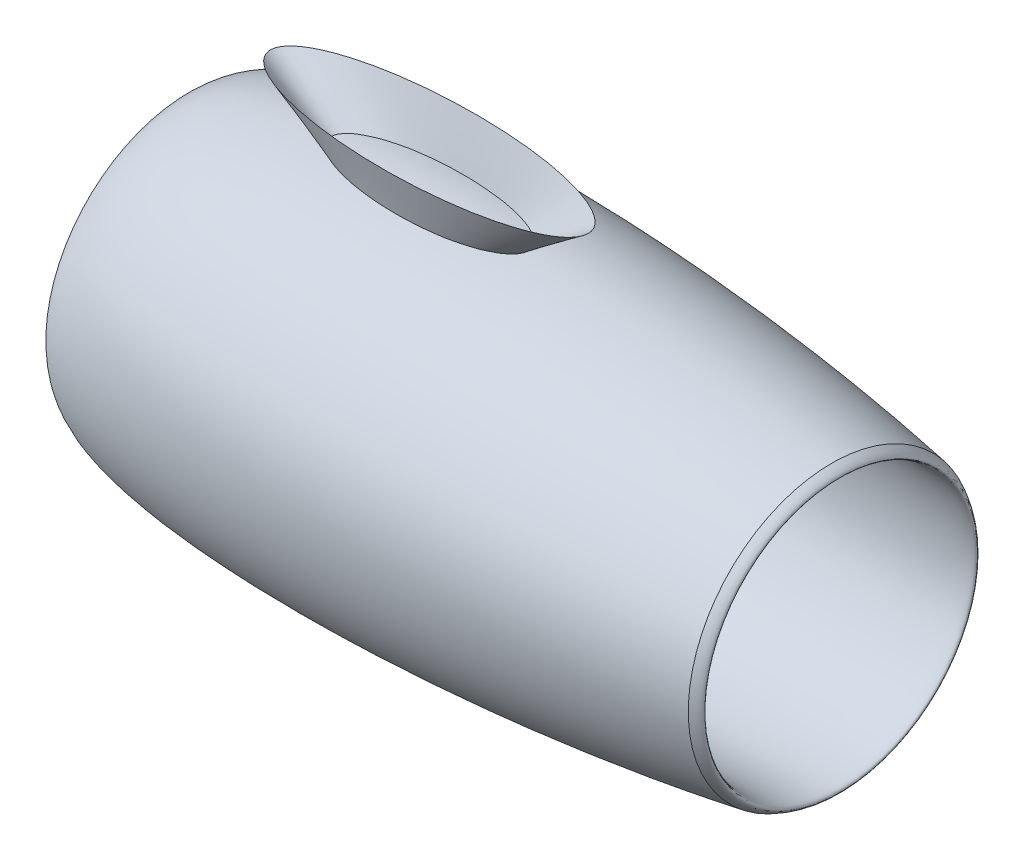
ISO-10303-21;
HEADER;
FILE_DESCRIPTION(('STEP AP214'),'2;1');
FILE_NAME('part.step','',(''),(''),'','','');
FILE_SCHEMA(('AUTOMOTIVE_DESIGN { 1 0 10303 214 1 1 1 1 }'));
ENDSEC;
DATA;
#1=APPLICATION_CONTEXT('core data for automotive mechanical design processes');
#2=APPLICATION_PROTOCOL_DEFINITION('international standard','automotive_design',2000,#1);
#3=PRODUCT_CONTEXT('',#1,'mechanical');
#4=PRODUCT('Part','Part','',(#3));
#5=PRODUCT_RELATED_PRODUCT_CATEGORY('part','',(#4));
#6=PRODUCT_DEFINITION_FORMATION('','',#4);
#7=PRODUCT_DEFINITION_CONTEXT('part definition',#1,'design');
#8=PRODUCT_DEFINITION('design','',#6,#7);
#9=PRODUCT_DEFINITION_SHAPE('','',#8);
#10=(LENGTH_UNIT() NAMED_UNIT(*) SI_UNIT(.MILLI.,.METRE.));
#11=(NAMED_UNIT(*) PLANE_ANGLE_UNIT() SI_UNIT($,.RADIAN.));
#12=(NAMED_UNIT(*) SI_UNIT($,.STERADIAN.) SOLID_ANGLE_UNIT());
#13=UNCERTAINTY_MEASURE_WITH_UNIT(LENGTH_MEASURE(1.E-05),#10,'distance_accuracy_value','');
#14=(GEOMETRIC_REPRESENTATION_CONTEXT(3) GLOBAL_UNCERTAINTY_ASSIGNED_CONTEXT((#13)) GLOBAL_UNIT_ASSIGNED_CONTEXT((#10,
#11,#12)) REPRESENTATION_CONTEXT('',''));
#15=CARTESIAN_POINT('',(0.,0.,0.));
#16=DIRECTION('',(0.,0.,1.));
#17=DIRECTION('',(1.,0.,0.));
#18=AXIS2_PLACEMENT_3D('',#15,#16,#17);
#19=CARTESIAN_POINT('',(-975.222832465383,900.,20.7662660225526));
#20=CARTESIAN_POINT('',(-711.589974985776,700.,-14.2371569140713));
#21=CARTESIAN_POINT('',(-1115.85052868828,900.,-359.814852146137));
#22=CARTESIAN_POINT('',(-630.438180575572,700.,-281.384033207584));
#23=CARTESIAN_POINT('',(172.78378370742,900.,-401.347384191243));
#24=CARTESIAN_POINT('',(130.930416860912,700.,-252.909719379441));
#25=CARTESIAN_POINT('',(313.411479930316,900.,-20.7662660225526));
#26=CARTESIAN_POINT('',(49.7786224507086,700.,14.2371569140713));
#27=CARTESIAN_POINT('',(454.039176153211,900.,359.814852146137));
#28=CARTESIAN_POINT('',(-31.3731719594948,700.,281.384033207584));
#29=CARTESIAN_POINT('',(-834.595136242487,900.,401.347384191243));
#30=CARTESIAN_POINT('',(-792.741769395979,700.,252.909719379441));
#31=CARTESIAN_POINT('',(-975.222832465383,900.,20.7662660225526));
#32=CARTESIAN_POINT('',(-711.589974985776,700.,-14.2371569140713));
#33=(BOUNDED_SURFACE() B_SPLINE_SURFACE(3,1,((#19,#20),(#21,#22),(#23,#24),(#25,#26),(#27,#28),
(#29,#30),(#31,#32)),.UNSPECIFIED.,.T.,.F.,.F.) B_SPLINE_SURFACE_WITH_KNOTS((4,3,4),(2,2),(0.,
0.5,1.),(0.,1.),.UNSPECIFIED.) GEOMETRIC_REPRESENTATION_ITEM() RATIONAL_B_SPLINE_SURFACE(((1.,
1.),(0.333333333333333,0.333333333333333),(0.333333333333333,0.333333333333333),(1.,1.),
(0.333333333333333,0.333333333333333),(0.333333333333333,0.333333333333333),(1.,1.))) REPRESENTATION_ITEM('') SURFACE());
#34=CARTESIAN_POINT('',(-975.222832465383,900.,20.7662660225526));
#35=CARTESIAN_POINT('',(-1115.85052868828,900.,-359.814852146137));
#36=CARTESIAN_POINT('',(172.78378370742,900.,-401.347384191243));
#37=CARTESIAN_POINT('',(313.411479930316,900.,-20.7662660225526));
#38=CARTESIAN_POINT('',(454.039176153211,900.,359.814852146137));
#39=CARTESIAN_POINT('',(-834.595136242487,900.,401.347384191243));
#40=CARTESIAN_POINT('',(-975.222832465383,900.,20.7662660225526));
#41=(BOUNDED_CURVE() B_SPLINE_CURVE(3,(#34,#35,#36,#37,#38,#39,#40),.UNSPECIFIED.,.T.,
.F.) B_SPLINE_CURVE_WITH_KNOTS((4,3,4),(0.,0.5,1.),
.UNSPECIFIED.) CURVE() GEOMETRIC_REPRESENTATION_ITEM() RATIONAL_B_SPLINE_CURVE((1.,
0.333333333333333,0.333333333333333,1.,0.333333333333333,0.333333333333333,1.)) REPRESENTATION_ITEM(''));
#42=CARTESIAN_POINT('',(-975.222832465383,900.,20.7662660225526));
#43=VERTEX_POINT('',#42);
#44=EDGE_CURVE('E11',#43,#43,#41,.T.);
#45=CARTESIAN_POINT('',(-711.589974985776,700.,-14.2371569140713));
#46=CARTESIAN_POINT('',(-630.438180575572,700.,-281.384033207584));
#47=CARTESIAN_POINT('',(130.930416860912,700.,-252.909719379441));
#48=CARTESIAN_POINT('',(49.7786224507086,700.,14.2371569140713));
#49=CARTESIAN_POINT('',(-31.3731719594948,700.,281.384033207584));
#50=CARTESIAN_POINT('',(-792.741769395979,700.,252.909719379441));
#51=CARTESIAN_POINT('',(-711.589974985776,700.,-14.2371569140713));
#52=(BOUNDED_CURVE() B_SPLINE_CURVE(3,(#45,#46,#47,#48,#49,#50,#51),.UNSPECIFIED.,.T.,
.F.) B_SPLINE_CURVE_WITH_KNOTS((4,3,4),(0.,0.5,1.),
.UNSPECIFIED.) CURVE() GEOMETRIC_REPRESENTATION_ITEM() RATIONAL_B_SPLINE_CURVE((1.,
0.333333333333333,0.333333333333333,1.,0.333333333333333,0.333333333333333,1.)) REPRESENTATION_ITEM(''));
#53=CARTESIAN_POINT('',(-711.589974985776,700.,-14.2371569140713));
#54=VERTEX_POINT('',#53);
#55=EDGE_CURVE('E52',#54,#54,#52,.F.);
#56=ORIENTED_EDGE('',*,*,#44,.T.);
#57=EDGE_LOOP('',(#56));
#58=FACE_BOUND('',#57,.T.);
#59=ORIENTED_EDGE('',*,*,#55,.T.);
#60=EDGE_LOOP('',(#59));
#61=FACE_BOUND('',#60,.T.);
#62=ADVANCED_FACE('F49',(#58,#61),#33,.T.);
#63=OPEN_SHELL('',(#62));
#64=SHELL_BASED_SURFACE_MODEL('B2',(#63));
#65=CARTESIAN_POINT('',(-1310.,585.,0.));
#66=CARTESIAN_POINT('',(-1336.64265916971,538.704358551279,0.));
#67=CARTESIAN_POINT('',(-1302.00196912695,278.759430217538,0.));
#68=CARTESIAN_POINT('',(-1035.27018713481,495.775031915625,0.));
#69=CARTESIAN_POINT('',(-550.883913441023,613.212317745158,0.));
#70=CARTESIAN_POINT('',(191.965915792832,637.824812087244,0.));
#71=CARTESIAN_POINT('',(930.340746055399,555.037331118411,0.));
#72=CARTESIAN_POINT('',(1530.94942161734,474.222922231257,0.));
#73=CARTESIAN_POINT('',(1310.,585.,0.));
#74=B_SPLINE_CURVE_WITH_KNOTS('',8,(#65,#66,#67,#68,#69,#70,#71,#72,#73),.UNSPECIFIED.,.F.,.F.,
(9,9),(0.,1.),.UNSPECIFIED.);
#75=CARTESIAN_POINT('',(0.,0.,0.));
#76=DIRECTION('',(1.,0.,0.));
#77=AXIS1_PLACEMENT('',#75,#76);
#78=SURFACE_OF_REVOLUTION('',#74,#77);
#79=CARTESIAN_POINT('',(1310.,0.,0.));
#80=DIRECTION('',(1.,0.,0.));
#81=DIRECTION('',(0.,0.,-1.));
#82=AXIS2_PLACEMENT_3D('',#79,#80,#81);
#83=CIRCLE('',#82,585.);
#84=CARTESIAN_POINT('',(1310.,0.,-585.));
#85=VERTEX_POINT('',#84);
#86=EDGE_CURVE('E96',#85,#85,#83,.T.);
#87=ORIENTED_EDGE('',*,*,#86,.T.);
#88=EDGE_LOOP('',(#87));
#89=FACE_BOUND('',#88,.T.);
#90=CARTESIAN_POINT('',(-1310.,0.,0.));
#91=DIRECTION('',(1.,0.,0.));
#92=DIRECTION('',(0.,0.,-1.));
#93=AXIS2_PLACEMENT_3D('',#90,#91,#92);
#94=CIRCLE('',#93,585.);
#95=CARTESIAN_POINT('',(-1310.,0.,-585.));
#96=VERTEX_POINT('',#95);
#97=EDGE_CURVE('E48',#96,#96,#94,.T.);
#98=ORIENTED_EDGE('',*,*,#97,.F.);
#99=EDGE_LOOP('',(#98));
#100=FACE_BOUND('',#99,.T.);
#101=ADVANCED_FACE('F89',(#89,#100),#78,.F.);
#102=CARTESIAN_POINT('',(1310.,585.,0.));
#103=CARTESIAN_POINT('',(170.320438249111,781.379838252815,0.));
#104=CARTESIAN_POINT('',(-1124.27360882152,770.576698458351,0.));
#105=CARTESIAN_POINT('',(-1310.,585.,0.));
#106=B_SPLINE_CURVE_WITH_KNOTS('',3,(#102,#103,#104,#105),.UNSPECIFIED.,.F.,.F.,(4,4),(0.,1.),.UNSPECIFIED.);
#107=CARTESIAN_POINT('',(0.,0.,0.));
#108=DIRECTION('',(1.,0.,0.));
#109=AXIS1_PLACEMENT('',#107,#108);
#110=SURFACE_OF_REVOLUTION('',#106,#109);
#111=ORIENTED_EDGE('',*,*,#97,.T.);
#112=EDGE_LOOP('',(#111));
#113=FACE_BOUND('',#112,.T.);
#114=ORIENTED_EDGE('',*,*,#86,.F.);
#115=EDGE_LOOP('',(#114));
#116=FACE_BOUND('',#115,.T.);
#117=ADVANCED_FACE('F112',(#113,#116),#110,.F.);
#118=CLOSED_SHELL('',(#101,#117));
#119=MANIFOLD_SOLID_BREP('B6',#118);
#120=ADVANCED_BREP_SHAPE_REPRESENTATION('',(#18,#119),#14);
#121=MANIFOLD_SURFACE_SHAPE_REPRESENTATION('',(#18,#64),#14);
#122=SHAPE_REPRESENTATION('',(#18),#14);
#123=SHAPE_DEFINITION_REPRESENTATION(#9,#122);
#124=SHAPE_REPRESENTATION_RELATIONSHIP('','',#122,#120);
#125=SHAPE_REPRESENTATION_RELATIONSHIP('','',#122,#121);
ENDSEC;
END-ISO-10303-21;
